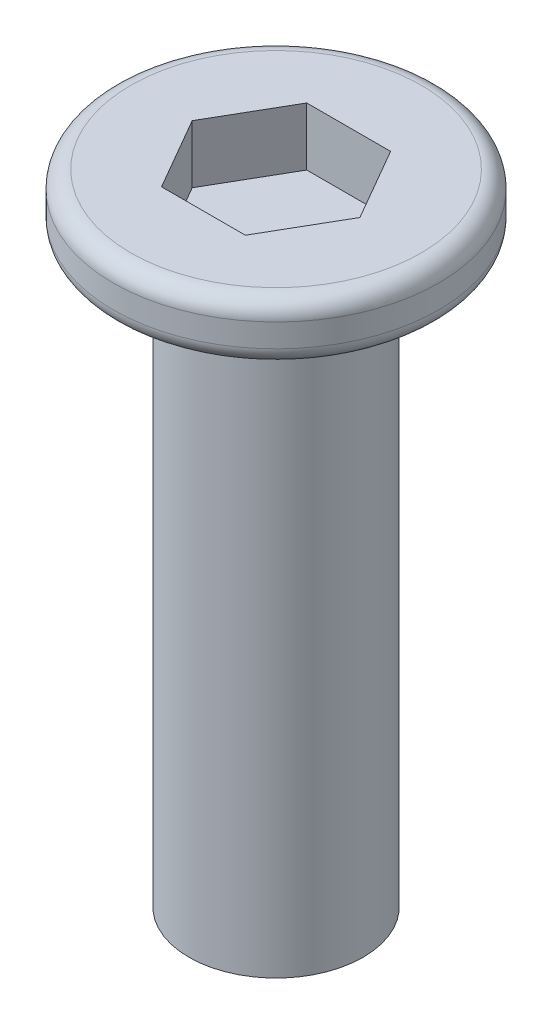
ISO-10303-21;
HEADER;
FILE_DESCRIPTION(('STEP AP214'),'2;1');
FILE_NAME('part.step','',(''),(''),'','','');
FILE_SCHEMA(('AUTOMOTIVE_DESIGN { 1 0 10303 214 1 1 1 1 }'));
ENDSEC;
DATA;
#1=APPLICATION_CONTEXT('core data for automotive mechanical design processes');
#2=APPLICATION_PROTOCOL_DEFINITION('international standard','automotive_design',2000,#1);
#3=PRODUCT_CONTEXT('',#1,'mechanical');
#4=PRODUCT('Part','Part','',(#3));
#5=PRODUCT_RELATED_PRODUCT_CATEGORY('part','',(#4));
#6=PRODUCT_DEFINITION_FORMATION('','',#4);
#7=PRODUCT_DEFINITION_CONTEXT('part definition',#1,'design');
#8=PRODUCT_DEFINITION('design','',#6,#7);
#9=PRODUCT_DEFINITION_SHAPE('','',#8);
#10=(LENGTH_UNIT() NAMED_UNIT(*) SI_UNIT(.MILLI.,.METRE.));
#11=(NAMED_UNIT(*) PLANE_ANGLE_UNIT() SI_UNIT($,.RADIAN.));
#12=(NAMED_UNIT(*) SI_UNIT($,.STERADIAN.) SOLID_ANGLE_UNIT());
#13=UNCERTAINTY_MEASURE_WITH_UNIT(LENGTH_MEASURE(1.E-05),#10,'distance_accuracy_value','');
#14=(GEOMETRIC_REPRESENTATION_CONTEXT(3) GLOBAL_UNCERTAINTY_ASSIGNED_CONTEXT((#13)) GLOBAL_UNIT_ASSIGNED_CONTEXT((#10,
#11,#12)) REPRESENTATION_CONTEXT('',''));
#15=CARTESIAN_POINT('',(0.,0.,0.));
#16=DIRECTION('',(0.,0.,1.));
#17=DIRECTION('',(1.,0.,0.));
#18=AXIS2_PLACEMENT_3D('',#15,#16,#17);
#19=CARTESIAN_POINT('',(0.,10.,0.));
#20=DIRECTION('',(0.,-1.,0.));
#21=DIRECTION('',(0.,0.,-1.));
#22=AXIS2_PLACEMENT_3D('',#19,#20,#21);
#23=CYLINDRICAL_SURFACE('',#22,1.5);
#24=CARTESIAN_POINT('',(0.,10.,0.));
#25=DIRECTION('',(0.,1.,0.));
#26=DIRECTION('',(0.,0.,1.));
#27=AXIS2_PLACEMENT_3D('',#24,#25,#26);
#28=CIRCLE('',#27,1.5);
#29=CARTESIAN_POINT('',(0.,10.,1.5));
#30=VERTEX_POINT('',#29);
#31=EDGE_CURVE('E166',#30,#30,#28,.T.);
#32=ORIENTED_EDGE('',*,*,#31,.F.);
#33=EDGE_LOOP('',(#32));
#34=FACE_BOUND('',#33,.T.);
#35=CARTESIAN_POINT('',(0.,0.,0.));
#36=DIRECTION('',(0.,1.,0.));
#37=DIRECTION('',(0.,0.,1.));
#38=AXIS2_PLACEMENT_3D('',#35,#36,#37);
#39=CIRCLE('',#38,1.5);
#40=CARTESIAN_POINT('',(0.,0.,1.5));
#41=VERTEX_POINT('',#40);
#42=EDGE_CURVE('E156',#41,#41,#39,.T.);
#43=ORIENTED_EDGE('',*,*,#42,.T.);
#44=EDGE_LOOP('',(#43));
#45=FACE_BOUND('',#44,.T.);
#46=ADVANCED_FACE('F41',(#34,#45),#23,.T.);
#47=CARTESIAN_POINT('',(0.,0.,0.));
#48=DIRECTION('',(0.,1.,0.));
#49=DIRECTION('',(0.,0.,1.));
#50=AXIS2_PLACEMENT_3D('',#47,#48,#49);
#51=PLANE('',#50);
#52=ORIENTED_EDGE('',*,*,#42,.F.);
#53=EDGE_LOOP('',(#52));
#54=FACE_BOUND('',#53,.T.);
#55=ADVANCED_FACE('F196',(#54),#51,.F.);
#56=CARTESIAN_POINT('',(0.,11.,0.));
#57=DIRECTION('',(0.,-1.,0.));
#58=DIRECTION('',(0.,0.,-1.));
#59=AXIS2_PLACEMENT_3D('',#56,#57,#58);
#60=CYLINDRICAL_SURFACE('',#59,2.8);
#61=CARTESIAN_POINT('',(0.,10.3,0.));
#62=DIRECTION('',(0.,1.,0.));
#63=DIRECTION('',(0.,0.,1.));
#64=AXIS2_PLACEMENT_3D('',#61,#62,#63);
#65=CIRCLE('',#64,2.8);
#66=CARTESIAN_POINT('',(0.,10.3,2.8));
#67=VERTEX_POINT('',#66);
#68=EDGE_CURVE('E177',#67,#67,#65,.T.);
#69=ORIENTED_EDGE('',*,*,#68,.T.);
#70=EDGE_LOOP('',(#69));
#71=FACE_BOUND('',#70,.T.);
#72=CARTESIAN_POINT('',(0.,10.7,0.));
#73=DIRECTION('',(0.,1.,0.));
#74=DIRECTION('',(0.,0.,1.));
#75=AXIS2_PLACEMENT_3D('',#72,#73,#74);
#76=CIRCLE('',#75,2.8);
#77=CARTESIAN_POINT('',(0.,10.7,2.8));
#78=VERTEX_POINT('',#77);
#79=EDGE_CURVE('E170',#78,#78,#76,.F.);
#80=ORIENTED_EDGE('',*,*,#79,.T.);
#81=EDGE_LOOP('',(#80));
#82=FACE_BOUND('',#81,.T.);
#83=ADVANCED_FACE('F192',(#71,#82),#60,.T.);
#84=CARTESIAN_POINT('',(0.,11.,0.));
#85=DIRECTION('',(0.,1.,0.));
#86=DIRECTION('',(0.,0.,1.));
#87=AXIS2_PLACEMENT_3D('',#84,#85,#86);
#88=PLANE('',#87);
#89=CARTESIAN_POINT('',(0.,11.,0.));
#90=DIRECTION('',(0.,1.,0.));
#91=DIRECTION('',(0.,0.,1.));
#92=AXIS2_PLACEMENT_3D('',#89,#90,#91);
#93=CIRCLE('',#92,2.5);
#94=CARTESIAN_POINT('',(0.,11.,2.5));
#95=VERTEX_POINT('',#94);
#96=EDGE_CURVE('E11',#95,#95,#93,.T.);
#97=ORIENTED_EDGE('',*,*,#96,.T.);
#98=EDGE_LOOP('',(#97));
#99=FACE_BOUND('',#98,.T.);
#100=DIRECTION('',(-0.5,0.,0.866025403784439));
#101=VECTOR('',#100,1.);
#102=CARTESIAN_POINT('',(-0.721687836487032,11.,-1.25));
#103=LINE('',#102,#101);
#104=CARTESIAN_POINT('',(-0.721687836487032,11.,-1.25));
#105=VERTEX_POINT('',#104);
#106=CARTESIAN_POINT('',(-1.44337567297407,11.,0.));
#107=VERTEX_POINT('',#106);
#108=EDGE_CURVE('E57',#105,#107,#103,.T.);
#109=ORIENTED_EDGE('',*,*,#108,.F.);
#110=DIRECTION('',(-1.,0.,0.));
#111=VECTOR('',#110,1.);
#112=CARTESIAN_POINT('',(0.721687836487032,11.,-1.25));
#113=LINE('',#112,#111);
#114=CARTESIAN_POINT('',(0.721687836487032,11.,-1.25));
#115=VERTEX_POINT('',#114);
#116=EDGE_CURVE('E150',#115,#105,#113,.T.);
#117=ORIENTED_EDGE('',*,*,#116,.F.);
#118=DIRECTION('',(-0.5,0.,-0.866025403784438));
#119=VECTOR('',#118,1.);
#120=CARTESIAN_POINT('',(1.44337567297406,11.,0.));
#121=LINE('',#120,#119);
#122=CARTESIAN_POINT('',(1.44337567297406,11.,0.));
#123=VERTEX_POINT('',#122);
#124=EDGE_CURVE('E147',#123,#115,#121,.T.);
#125=ORIENTED_EDGE('',*,*,#124,.F.);
#126=DIRECTION('',(0.5,0.,-0.866025403784439));
#127=VECTOR('',#126,1.);
#128=CARTESIAN_POINT('',(0.721687836487032,11.,1.25));
#129=LINE('',#128,#127);
#130=CARTESIAN_POINT('',(0.721687836487032,11.,1.25));
#131=VERTEX_POINT('',#130);
#132=EDGE_CURVE('E105',#131,#123,#129,.T.);
#133=ORIENTED_EDGE('',*,*,#132,.F.);
#134=DIRECTION('',(1.,0.,0.));
#135=VECTOR('',#134,1.);
#136=CARTESIAN_POINT('',(-0.721687836487033,11.,1.25));
#137=LINE('',#136,#135);
#138=CARTESIAN_POINT('',(-0.721687836487033,11.,1.25));
#139=VERTEX_POINT('',#138);
#140=EDGE_CURVE('E141',#139,#131,#137,.T.);
#141=ORIENTED_EDGE('',*,*,#140,.F.);
#142=DIRECTION('',(0.5,0.,0.866025403784439));
#143=VECTOR('',#142,1.);
#144=CARTESIAN_POINT('',(-1.44337567297407,11.,0.));
#145=LINE('',#144,#143);
#146=EDGE_CURVE('E137',#107,#139,#145,.T.);
#147=ORIENTED_EDGE('',*,*,#146,.F.);
#148=EDGE_LOOP('',(#109,#117,#125,#133,#141,#147));
#149=FACE_BOUND('',#148,.T.);
#150=ADVANCED_FACE('F195',(#99,#149),#88,.T.);
#151=CARTESIAN_POINT('',(0.,10.,0.));
#152=DIRECTION('',(0.,1.,0.));
#153=DIRECTION('',(0.,0.,1.));
#154=AXIS2_PLACEMENT_3D('',#151,#152,#153);
#155=PLANE('',#154);
#156=CARTESIAN_POINT('',(0.,10.,0.));
#157=DIRECTION('',(0.,1.,0.));
#158=DIRECTION('',(0.,0.,1.));
#159=AXIS2_PLACEMENT_3D('',#156,#157,#158);
#160=CIRCLE('',#159,2.5);
#161=CARTESIAN_POINT('',(0.,10.,2.5));
#162=VERTEX_POINT('',#161);
#163=EDGE_CURVE('E50',#162,#162,#160,.F.);
#164=ORIENTED_EDGE('',*,*,#163,.T.);
#165=EDGE_LOOP('',(#164));
#166=FACE_BOUND('',#165,.T.);
#167=ORIENTED_EDGE('',*,*,#31,.T.);
#168=EDGE_LOOP('',(#167));
#169=FACE_BOUND('',#168,.T.);
#170=ADVANCED_FACE('F184',(#166,#169),#155,.F.);
#171=CARTESIAN_POINT('',(-0.721687836487032,10.,-1.25));
#172=DIRECTION('',(-0.866025403784439,0.,-0.5));
#173=DIRECTION('',(-0.5,0.,0.866025403784439));
#174=AXIS2_PLACEMENT_3D('',#171,#172,#173);
#175=PLANE('',#174);
#176=ORIENTED_EDGE('',*,*,#108,.T.);
#177=DIRECTION('',(0.,1.,0.));
#178=VECTOR('',#177,1.);
#179=CARTESIAN_POINT('',(-1.44337567297407,10.,0.));
#180=LINE('',#179,#178);
#181=CARTESIAN_POINT('',(-1.44337567297407,10.,0.));
#182=VERTEX_POINT('',#181);
#183=EDGE_CURVE('E87',#182,#107,#180,.T.);
#184=ORIENTED_EDGE('',*,*,#183,.F.);
#185=DIRECTION('',(-0.5,0.,0.866025403784439));
#186=VECTOR('',#185,1.);
#187=CARTESIAN_POINT('',(-0.721687836487032,10.,-1.25));
#188=LINE('',#187,#186);
#189=CARTESIAN_POINT('',(-0.721687836487032,10.,-1.25));
#190=VERTEX_POINT('',#189);
#191=EDGE_CURVE('E153',#190,#182,#188,.T.);
#192=ORIENTED_EDGE('',*,*,#191,.F.);
#193=DIRECTION('',(0.,1.,0.));
#194=VECTOR('',#193,1.);
#195=CARTESIAN_POINT('',(-0.721687836487032,10.,-1.25));
#196=LINE('',#195,#194);
#197=EDGE_CURVE('E65',#190,#105,#196,.T.);
#198=ORIENTED_EDGE('',*,*,#197,.T.);
#199=EDGE_LOOP('',(#176,#184,#192,#198));
#200=FACE_BOUND('',#199,.T.);
#201=ADVANCED_FACE('F215',(#200),#175,.F.);
#202=CARTESIAN_POINT('',(0.721687836487032,10.,-1.25));
#203=DIRECTION('',(0.,0.,-1.));
#204=DIRECTION('',(-1.,0.,0.));
#205=AXIS2_PLACEMENT_3D('',#202,#203,#204);
#206=PLANE('',#205);
#207=ORIENTED_EDGE('',*,*,#116,.T.);
#208=ORIENTED_EDGE('',*,*,#197,.F.);
#209=DIRECTION('',(-1.,0.,0.));
#210=VECTOR('',#209,1.);
#211=CARTESIAN_POINT('',(0.721687836487032,10.,-1.25));
#212=LINE('',#211,#210);
#213=CARTESIAN_POINT('',(0.721687836487032,10.,-1.25));
#214=VERTEX_POINT('',#213);
#215=EDGE_CURVE('E119',#214,#190,#212,.T.);
#216=ORIENTED_EDGE('',*,*,#215,.F.);
#217=DIRECTION('',(0.,1.,0.));
#218=VECTOR('',#217,1.);
#219=CARTESIAN_POINT('',(0.721687836487032,10.,-1.25));
#220=LINE('',#219,#218);
#221=EDGE_CURVE('E110',#214,#115,#220,.T.);
#222=ORIENTED_EDGE('',*,*,#221,.T.);
#223=EDGE_LOOP('',(#207,#208,#216,#222));
#224=FACE_BOUND('',#223,.T.);
#225=ADVANCED_FACE('F217',(#224),#206,.F.);
#226=CARTESIAN_POINT('',(1.44337567297406,10.,0.));
#227=DIRECTION('',(0.866025403784439,0.,-0.5));
#228=DIRECTION('',(-0.5,0.,-0.866025403784439));
#229=AXIS2_PLACEMENT_3D('',#226,#227,#228);
#230=PLANE('',#229);
#231=ORIENTED_EDGE('',*,*,#124,.T.);
#232=ORIENTED_EDGE('',*,*,#221,.F.);
#233=DIRECTION('',(-0.5,0.,-0.866025403784438));
#234=VECTOR('',#233,1.);
#235=CARTESIAN_POINT('',(1.44337567297406,10.,0.));
#236=LINE('',#235,#234);
#237=CARTESIAN_POINT('',(1.44337567297406,10.,0.));
#238=VERTEX_POINT('',#237);
#239=EDGE_CURVE('E114',#238,#214,#236,.T.);
#240=ORIENTED_EDGE('',*,*,#239,.F.);
#241=DIRECTION('',(0.,1.,0.));
#242=VECTOR('',#241,1.);
#243=CARTESIAN_POINT('',(1.44337567297406,10.,0.));
#244=LINE('',#243,#242);
#245=EDGE_CURVE('E98',#238,#123,#244,.T.);
#246=ORIENTED_EDGE('',*,*,#245,.T.);
#247=EDGE_LOOP('',(#231,#232,#240,#246));
#248=FACE_BOUND('',#247,.T.);
#249=ADVANCED_FACE('F115',(#248),#230,.F.);
#250=CARTESIAN_POINT('',(0.721687836487032,10.,1.25));
#251=DIRECTION('',(0.866025403784439,0.,0.5));
#252=DIRECTION('',(0.5,0.,-0.866025403784439));
#253=AXIS2_PLACEMENT_3D('',#250,#251,#252);
#254=PLANE('',#253);
#255=ORIENTED_EDGE('',*,*,#132,.T.);
#256=ORIENTED_EDGE('',*,*,#245,.F.);
#257=DIRECTION('',(0.5,0.,-0.866025403784439));
#258=VECTOR('',#257,1.);
#259=CARTESIAN_POINT('',(0.721687836487032,10.,1.25));
#260=LINE('',#259,#258);
#261=CARTESIAN_POINT('',(0.721687836487032,10.,1.25));
#262=VERTEX_POINT('',#261);
#263=EDGE_CURVE('E102',#262,#238,#260,.T.);
#264=ORIENTED_EDGE('',*,*,#263,.F.);
#265=DIRECTION('',(0.,1.,0.));
#266=VECTOR('',#265,1.);
#267=CARTESIAN_POINT('',(0.721687836487032,10.,1.25));
#268=LINE('',#267,#266);
#269=EDGE_CURVE('E111',#262,#131,#268,.T.);
#270=ORIENTED_EDGE('',*,*,#269,.T.);
#271=EDGE_LOOP('',(#255,#256,#264,#270));
#272=FACE_BOUND('',#271,.T.);
#273=ADVANCED_FACE('F100',(#272),#254,.F.);
#274=CARTESIAN_POINT('',(-0.721687836487033,10.,1.25));
#275=DIRECTION('',(0.,0.,1.));
#276=DIRECTION('',(1.,0.,0.));
#277=AXIS2_PLACEMENT_3D('',#274,#275,#276);
#278=PLANE('',#277);
#279=ORIENTED_EDGE('',*,*,#140,.T.);
#280=ORIENTED_EDGE('',*,*,#269,.F.);
#281=DIRECTION('',(1.,0.,0.));
#282=VECTOR('',#281,1.);
#283=CARTESIAN_POINT('',(-0.721687836487033,10.,1.25));
#284=LINE('',#283,#282);
#285=CARTESIAN_POINT('',(-0.721687836487033,10.,1.25));
#286=VERTEX_POINT('',#285);
#287=EDGE_CURVE('E125',#286,#262,#284,.T.);
#288=ORIENTED_EDGE('',*,*,#287,.F.);
#289=DIRECTION('',(0.,1.,0.));
#290=VECTOR('',#289,1.);
#291=CARTESIAN_POINT('',(-0.721687836487033,10.,1.25));
#292=LINE('',#291,#290);
#293=EDGE_CURVE('E161',#286,#139,#292,.T.);
#294=ORIENTED_EDGE('',*,*,#293,.T.);
#295=EDGE_LOOP('',(#279,#280,#288,#294));
#296=FACE_BOUND('',#295,.T.);
#297=ADVANCED_FACE('F278',(#296),#278,.F.);
#298=CARTESIAN_POINT('',(-1.44337567297407,10.,0.));
#299=DIRECTION('',(-0.866025403784439,0.,0.5));
#300=DIRECTION('',(0.5,0.,0.866025403784439));
#301=AXIS2_PLACEMENT_3D('',#298,#299,#300);
#302=PLANE('',#301);
#303=ORIENTED_EDGE('',*,*,#146,.T.);
#304=ORIENTED_EDGE('',*,*,#293,.F.);
#305=DIRECTION('',(0.5,0.,0.866025403784439));
#306=VECTOR('',#305,1.);
#307=CARTESIAN_POINT('',(-1.44337567297407,10.,0.));
#308=LINE('',#307,#306);
#309=EDGE_CURVE('E129',#182,#286,#308,.T.);
#310=ORIENTED_EDGE('',*,*,#309,.F.);
#311=ORIENTED_EDGE('',*,*,#183,.T.);
#312=EDGE_LOOP('',(#303,#304,#310,#311));
#313=FACE_BOUND('',#312,.T.);
#314=ADVANCED_FACE('F211',(#313),#302,.F.);
#315=CARTESIAN_POINT('',(0.,10.,0.));
#316=DIRECTION('',(0.,1.,0.));
#317=DIRECTION('',(0.,0.,1.));
#318=AXIS2_PLACEMENT_3D('',#315,#316,#317);
#319=PLANE('',#318);
#320=ORIENTED_EDGE('',*,*,#191,.T.);
#321=ORIENTED_EDGE('',*,*,#309,.T.);
#322=ORIENTED_EDGE('',*,*,#287,.T.);
#323=ORIENTED_EDGE('',*,*,#263,.T.);
#324=ORIENTED_EDGE('',*,*,#239,.T.);
#325=ORIENTED_EDGE('',*,*,#215,.T.);
#326=EDGE_LOOP('',(#320,#321,#322,#323,#324,#325));
#327=FACE_BOUND('',#326,.T.);
#328=ADVANCED_FACE('F122',(#327),#319,.T.);
#329=CARTESIAN_POINT('',(0.,10.3,0.));
#330=DIRECTION('',(0.,1.,0.));
#331=DIRECTION('',(0.,0.,1.));
#332=AXIS2_PLACEMENT_3D('',#329,#330,#331);
#333=TOROIDAL_SURFACE('',#332,2.5,0.3);
#334=ORIENTED_EDGE('',*,*,#163,.F.);
#335=EDGE_LOOP('',(#334));
#336=FACE_BOUND('',#335,.T.);
#337=ORIENTED_EDGE('',*,*,#68,.F.);
#338=EDGE_LOOP('',(#337));
#339=FACE_BOUND('',#338,.T.);
#340=ADVANCED_FACE('F187',(#336,#339),#333,.T.);
#341=CARTESIAN_POINT('',(0.,10.7,0.));
#342=DIRECTION('',(0.,1.,0.));
#343=DIRECTION('',(0.,0.,1.));
#344=AXIS2_PLACEMENT_3D('',#341,#342,#343);
#345=TOROIDAL_SURFACE('',#344,2.5,0.3);
#346=ORIENTED_EDGE('',*,*,#79,.F.);
#347=EDGE_LOOP('',(#346));
#348=FACE_BOUND('',#347,.T.);
#349=ORIENTED_EDGE('',*,*,#96,.F.);
#350=EDGE_LOOP('',(#349));
#351=FACE_BOUND('',#350,.T.);
#352=ADVANCED_FACE('F43',(#348,#351),#345,.T.);
#353=CLOSED_SHELL('',(#46,#55,#83,#150,#170,#201,#225,#249,#273,#297,#314,#328,#340,#352));
#354=MANIFOLD_SOLID_BREP('B2',#353);
#355=ADVANCED_BREP_SHAPE_REPRESENTATION('',(#18,#354),#14);
#356=SHAPE_DEFINITION_REPRESENTATION(#9,#355);
ENDSEC;
END-ISO-10303-21;
